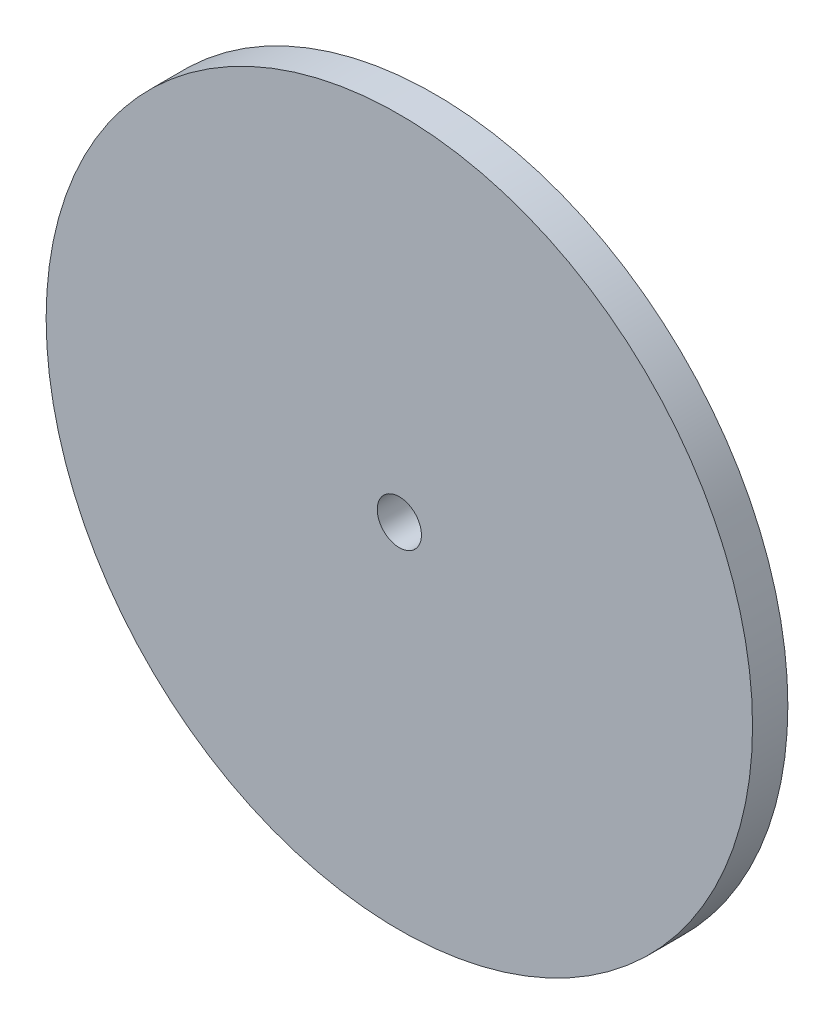
ISO-10303-21;
HEADER;
FILE_DESCRIPTION(('STEP AP214'),'2;1');
FILE_NAME('part.step','',(''),(''),'','','');
FILE_SCHEMA(('AUTOMOTIVE_DESIGN { 1 0 10303 214 1 1 1 1 }'));
ENDSEC;
DATA;
#1=APPLICATION_CONTEXT('core data for automotive mechanical design processes');
#2=APPLICATION_PROTOCOL_DEFINITION('international standard','automotive_design',2000,#1);
#3=PRODUCT_CONTEXT('',#1,'mechanical');
#4=PRODUCT('Part','Part','',(#3));
#5=PRODUCT_RELATED_PRODUCT_CATEGORY('part','',(#4));
#6=PRODUCT_DEFINITION_FORMATION('','',#4);
#7=PRODUCT_DEFINITION_CONTEXT('part definition',#1,'design');
#8=PRODUCT_DEFINITION('design','',#6,#7);
#9=PRODUCT_DEFINITION_SHAPE('','',#8);
#10=(LENGTH_UNIT() NAMED_UNIT(*) SI_UNIT(.MILLI.,.METRE.));
#11=(NAMED_UNIT(*) PLANE_ANGLE_UNIT() SI_UNIT($,.RADIAN.));
#12=(NAMED_UNIT(*) SI_UNIT($,.STERADIAN.) SOLID_ANGLE_UNIT());
#13=UNCERTAINTY_MEASURE_WITH_UNIT(LENGTH_MEASURE(1.E-05),#10,'distance_accuracy_value','');
#14=(GEOMETRIC_REPRESENTATION_CONTEXT(3) GLOBAL_UNCERTAINTY_ASSIGNED_CONTEXT((#13)) GLOBAL_UNIT_ASSIGNED_CONTEXT((#10,
#11,#12)) REPRESENTATION_CONTEXT('',''));
#15=CARTESIAN_POINT('',(0.,0.,0.));
#16=DIRECTION('',(0.,0.,1.));
#17=DIRECTION('',(1.,0.,0.));
#18=AXIS2_PLACEMENT_3D('',#15,#16,#17);
#19=CARTESIAN_POINT('',(0.,0.,4.));
#20=DIRECTION('',(0.,0.,-1.));
#21=DIRECTION('',(-1.,0.,0.));
#22=AXIS2_PLACEMENT_3D('',#19,#20,#21);
#23=CYLINDRICAL_SURFACE('',#22,40.);
#24=CARTESIAN_POINT('',(0.,0.,4.));
#25=DIRECTION('',(0.,0.,1.));
#26=DIRECTION('',(1.,0.,0.));
#27=AXIS2_PLACEMENT_3D('',#24,#25,#26);
#28=CIRCLE('',#27,40.);
#29=CARTESIAN_POINT('',(40.,0.,4.));
#30=VERTEX_POINT('',#29);
#31=EDGE_CURVE('E10',#30,#30,#28,.T.);
#32=ORIENTED_EDGE('',*,*,#31,.F.);
#33=EDGE_LOOP('',(#32));
#34=FACE_BOUND('',#33,.T.);
#35=CARTESIAN_POINT('',(0.,0.,0.));
#36=DIRECTION('',(0.,0.,1.));
#37=DIRECTION('',(1.,0.,0.));
#38=AXIS2_PLACEMENT_3D('',#35,#36,#37);
#39=CIRCLE('',#38,40.);
#40=CARTESIAN_POINT('',(40.,0.,0.));
#41=VERTEX_POINT('',#40);
#42=EDGE_CURVE('E44',#41,#41,#39,.T.);
#43=ORIENTED_EDGE('',*,*,#42,.T.);
#44=EDGE_LOOP('',(#43));
#45=FACE_BOUND('',#44,.T.);
#46=ADVANCED_FACE('F41',(#34,#45),#23,.T.);
#47=CARTESIAN_POINT('',(0.,0.,4.));
#48=DIRECTION('',(0.,0.,1.));
#49=DIRECTION('',(1.,0.,0.));
#50=AXIS2_PLACEMENT_3D('',#47,#48,#49);
#51=PLANE('',#50);
#52=CARTESIAN_POINT('',(0.,0.,4.));
#53=DIRECTION('',(0.,0.,1.));
#54=DIRECTION('',(1.,0.,0.));
#55=AXIS2_PLACEMENT_3D('',#52,#53,#54);
#56=CIRCLE('',#55,2.5);
#57=CARTESIAN_POINT('',(2.5,0.,4.));
#58=VERTEX_POINT('',#57);
#59=EDGE_CURVE('E55',#58,#58,#56,.T.);
#60=ORIENTED_EDGE('',*,*,#59,.F.);
#61=EDGE_LOOP('',(#60));
#62=FACE_BOUND('',#61,.T.);
#63=ORIENTED_EDGE('',*,*,#31,.T.);
#64=EDGE_LOOP('',(#63));
#65=FACE_BOUND('',#64,.T.);
#66=ADVANCED_FACE('F72',(#62,#65),#51,.T.);
#67=CARTESIAN_POINT('',(0.,0.,0.));
#68=DIRECTION('',(0.,0.,1.));
#69=DIRECTION('',(1.,0.,0.));
#70=AXIS2_PLACEMENT_3D('',#67,#68,#69);
#71=PLANE('',#70);
#72=CARTESIAN_POINT('',(0.,0.,0.));
#73=DIRECTION('',(0.,0.,1.));
#74=DIRECTION('',(1.,0.,0.));
#75=AXIS2_PLACEMENT_3D('',#72,#73,#74);
#76=CIRCLE('',#75,2.5);
#77=CARTESIAN_POINT('',(2.5,0.,0.));
#78=VERTEX_POINT('',#77);
#79=EDGE_CURVE('E53',#78,#78,#76,.T.);
#80=ORIENTED_EDGE('',*,*,#79,.T.);
#81=EDGE_LOOP('',(#80));
#82=FACE_BOUND('',#81,.T.);
#83=ORIENTED_EDGE('',*,*,#42,.F.);
#84=EDGE_LOOP('',(#83));
#85=FACE_BOUND('',#84,.T.);
#86=ADVANCED_FACE('F63',(#82,#85),#71,.F.);
#87=CARTESIAN_POINT('',(0.,0.,0.));
#88=DIRECTION('',(0.,0.,1.));
#89=DIRECTION('',(1.,0.,0.));
#90=AXIS2_PLACEMENT_3D('',#87,#88,#89);
#91=CYLINDRICAL_SURFACE('',#90,2.5);
#92=ORIENTED_EDGE('',*,*,#79,.F.);
#93=EDGE_LOOP('',(#92));
#94=FACE_BOUND('',#93,.T.);
#95=ORIENTED_EDGE('',*,*,#59,.T.);
#96=EDGE_LOOP('',(#95));
#97=FACE_BOUND('',#96,.T.);
#98=ADVANCED_FACE('F66',(#94,#97),#91,.F.);
#99=CLOSED_SHELL('',(#46,#66,#86,#98));
#100=MANIFOLD_SOLID_BREP('B2',#99);
#101=ADVANCED_BREP_SHAPE_REPRESENTATION('',(#18,#100),#14);
#102=SHAPE_DEFINITION_REPRESENTATION(#9,#101);
ENDSEC;
END-ISO-10303-21;
